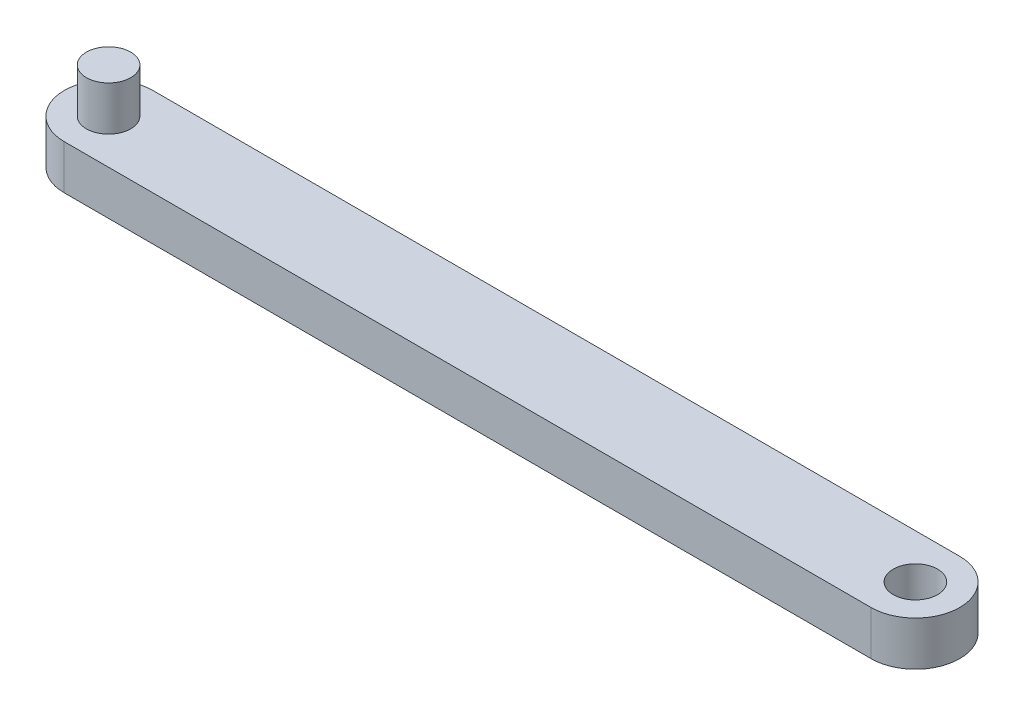
ISO-10303-21;
HEADER;
FILE_DESCRIPTION(('STEP AP214'),'2;1');
FILE_NAME('part.step','',(''),(''),'','','');
FILE_SCHEMA(('AUTOMOTIVE_DESIGN { 1 0 10303 214 1 1 1 1 }'));
ENDSEC;
DATA;
#1=APPLICATION_CONTEXT('core data for automotive mechanical design processes');
#2=APPLICATION_PROTOCOL_DEFINITION('international standard','automotive_design',2000,#1);
#3=PRODUCT_CONTEXT('',#1,'mechanical');
#4=PRODUCT('Part','Part','',(#3));
#5=PRODUCT_RELATED_PRODUCT_CATEGORY('part','',(#4));
#6=PRODUCT_DEFINITION_FORMATION('','',#4);
#7=PRODUCT_DEFINITION_CONTEXT('part definition',#1,'design');
#8=PRODUCT_DEFINITION('design','',#6,#7);
#9=PRODUCT_DEFINITION_SHAPE('','',#8);
#10=(LENGTH_UNIT() NAMED_UNIT(*) SI_UNIT(.MILLI.,.METRE.));
#11=(NAMED_UNIT(*) PLANE_ANGLE_UNIT() SI_UNIT($,.RADIAN.));
#12=(NAMED_UNIT(*) SI_UNIT($,.STERADIAN.) SOLID_ANGLE_UNIT());
#13=UNCERTAINTY_MEASURE_WITH_UNIT(LENGTH_MEASURE(1.E-05),#10,'distance_accuracy_value','');
#14=(GEOMETRIC_REPRESENTATION_CONTEXT(3) GLOBAL_UNCERTAINTY_ASSIGNED_CONTEXT((#13)) GLOBAL_UNIT_ASSIGNED_CONTEXT((#10,
#11,#12)) REPRESENTATION_CONTEXT('',''));
#15=CARTESIAN_POINT('',(0.,0.,0.));
#16=DIRECTION('',(0.,0.,1.));
#17=DIRECTION('',(1.,0.,0.));
#18=AXIS2_PLACEMENT_3D('',#15,#16,#17);
#19=CARTESIAN_POINT('',(91.,5.,0.));
#20=DIRECTION('',(0.,-1.,0.));
#21=DIRECTION('',(0.,0.,-1.));
#22=AXIS2_PLACEMENT_3D('',#19,#20,#21);
#23=PLANE('',#22);
#24=CARTESIAN_POINT('',(91.,5.,0.));
#25=DIRECTION('',(0.,1.,0.));
#26=DIRECTION('',(0.,0.,-1.));
#27=AXIS2_PLACEMENT_3D('',#24,#25,#26);
#28=CIRCLE('',#27,10.);
#29=CARTESIAN_POINT('',(91.,5.,10.));
#30=VERTEX_POINT('',#29);
#31=CARTESIAN_POINT('',(91.,5.,-10.));
#32=VERTEX_POINT('',#31);
#33=EDGE_CURVE('E92',#30,#32,#28,.T.);
#34=ORIENTED_EDGE('',*,*,#33,.T.);
#35=DIRECTION('',(-1.,0.,0.));
#36=VECTOR('',#35,1.);
#37=CARTESIAN_POINT('',(-91.,5.,-9.99999999999999));
#38=LINE('',#37,#36);
#39=CARTESIAN_POINT('',(-91.,5.,-9.99999999999999));
#40=VERTEX_POINT('',#39);
#41=EDGE_CURVE('E87',#32,#40,#38,.T.);
#42=ORIENTED_EDGE('',*,*,#41,.T.);
#43=CARTESIAN_POINT('',(-91.,5.,0.));
#44=DIRECTION('',(0.,1.,0.));
#45=DIRECTION('',(0.,0.,-1.));
#46=AXIS2_PLACEMENT_3D('',#43,#44,#45);
#47=CIRCLE('',#46,10.);
#48=CARTESIAN_POINT('',(-91.,5.,10.));
#49=VERTEX_POINT('',#48);
#50=EDGE_CURVE('E90',#40,#49,#47,.T.);
#51=ORIENTED_EDGE('',*,*,#50,.T.);
#52=DIRECTION('',(1.,0.,0.));
#53=VECTOR('',#52,1.);
#54=CARTESIAN_POINT('',(-91.,5.,10.));
#55=LINE('',#54,#53);
#56=EDGE_CURVE('E57',#49,#30,#55,.T.);
#57=ORIENTED_EDGE('',*,*,#56,.T.);
#58=EDGE_LOOP('',(#34,#42,#51,#57));
#59=FACE_BOUND('',#58,.T.);
#60=CARTESIAN_POINT('',(-91.,5.,0.));
#61=DIRECTION('',(0.,1.,0.));
#62=DIRECTION('',(0.,0.,1.));
#63=AXIS2_PLACEMENT_3D('',#60,#61,#62);
#64=CIRCLE('',#63,5.);
#65=CARTESIAN_POINT('',(-91.,5.,5.00000000000001));
#66=VERTEX_POINT('',#65);
#67=EDGE_CURVE('E112',#66,#66,#64,.T.);
#68=ORIENTED_EDGE('',*,*,#67,.F.);
#69=EDGE_LOOP('',(#68));
#70=FACE_BOUND('',#69,.T.);
#71=CARTESIAN_POINT('',(91.,5.,0.));
#72=DIRECTION('',(0.,1.,0.));
#73=DIRECTION('',(0.,0.,1.));
#74=AXIS2_PLACEMENT_3D('',#71,#72,#73);
#75=CIRCLE('',#74,5.);
#76=CARTESIAN_POINT('',(91.,5.,5.));
#77=VERTEX_POINT('',#76);
#78=EDGE_CURVE('E133',#77,#77,#75,.T.);
#79=ORIENTED_EDGE('',*,*,#78,.F.);
#80=EDGE_LOOP('',(#79));
#81=FACE_BOUND('',#80,.T.);
#82=ADVANCED_FACE('F39',(#59,#70,#81),#23,.F.);
#83=CARTESIAN_POINT('',(91.,-5.,0.));
#84=DIRECTION('',(0.,-1.,0.));
#85=DIRECTION('',(0.,0.,-1.));
#86=AXIS2_PLACEMENT_3D('',#83,#84,#85);
#87=PLANE('',#86);
#88=CARTESIAN_POINT('',(91.,-5.,0.));
#89=DIRECTION('',(0.,1.,0.));
#90=DIRECTION('',(0.,0.,-1.));
#91=AXIS2_PLACEMENT_3D('',#88,#89,#90);
#92=CIRCLE('',#91,10.);
#93=CARTESIAN_POINT('',(91.,-5.,10.));
#94=VERTEX_POINT('',#93);
#95=CARTESIAN_POINT('',(91.,-5.,-10.));
#96=VERTEX_POINT('',#95);
#97=EDGE_CURVE('E108',#94,#96,#92,.T.);
#98=ORIENTED_EDGE('',*,*,#97,.F.);
#99=DIRECTION('',(1.,0.,0.));
#100=VECTOR('',#99,1.);
#101=CARTESIAN_POINT('',(-91.,-5.,10.));
#102=LINE('',#101,#100);
#103=CARTESIAN_POINT('',(-91.,-5.,10.));
#104=VERTEX_POINT('',#103);
#105=EDGE_CURVE('E80',#104,#94,#102,.T.);
#106=ORIENTED_EDGE('',*,*,#105,.F.);
#107=CARTESIAN_POINT('',(-91.,-5.,0.));
#108=DIRECTION('',(0.,1.,0.));
#109=DIRECTION('',(0.,0.,-1.));
#110=AXIS2_PLACEMENT_3D('',#107,#108,#109);
#111=CIRCLE('',#110,10.);
#112=CARTESIAN_POINT('',(-91.,-5.,-9.99999999999999));
#113=VERTEX_POINT('',#112);
#114=EDGE_CURVE('E74',#113,#104,#111,.T.);
#115=ORIENTED_EDGE('',*,*,#114,.F.);
#116=DIRECTION('',(-1.,0.,0.));
#117=VECTOR('',#116,1.);
#118=CARTESIAN_POINT('',(-91.,-5.,-9.99999999999999));
#119=LINE('',#118,#117);
#120=EDGE_CURVE('E97',#96,#113,#119,.T.);
#121=ORIENTED_EDGE('',*,*,#120,.F.);
#122=EDGE_LOOP('',(#98,#106,#115,#121));
#123=FACE_BOUND('',#122,.T.);
#124=CARTESIAN_POINT('',(91.,-5.,0.));
#125=DIRECTION('',(0.,1.,0.));
#126=DIRECTION('',(0.,0.,1.));
#127=AXIS2_PLACEMENT_3D('',#124,#125,#126);
#128=CIRCLE('',#127,5.);
#129=CARTESIAN_POINT('',(91.,-5.,5.));
#130=VERTEX_POINT('',#129);
#131=EDGE_CURVE('E134',#130,#130,#128,.T.);
#132=ORIENTED_EDGE('',*,*,#131,.T.);
#133=EDGE_LOOP('',(#132));
#134=FACE_BOUND('',#133,.T.);
#135=ADVANCED_FACE('F125',(#123,#134),#87,.T.);
#136=CARTESIAN_POINT('',(91.,5.,0.));
#137=DIRECTION('',(0.,-1.,0.));
#138=DIRECTION('',(0.,0.,-1.));
#139=AXIS2_PLACEMENT_3D('',#136,#137,#138);
#140=CYLINDRICAL_SURFACE('',#139,10.);
#141=ORIENTED_EDGE('',*,*,#97,.T.);
#142=DIRECTION('',(0.,-1.,0.));
#143=VECTOR('',#142,1.);
#144=CARTESIAN_POINT('',(91.,5.,-10.));
#145=LINE('',#144,#143);
#146=EDGE_CURVE('E11',#32,#96,#145,.T.);
#147=ORIENTED_EDGE('',*,*,#146,.F.);
#148=ORIENTED_EDGE('',*,*,#33,.F.);
#149=DIRECTION('',(0.,-1.,0.));
#150=VECTOR('',#149,1.);
#151=CARTESIAN_POINT('',(91.,5.,10.));
#152=LINE('',#151,#150);
#153=EDGE_CURVE('E104',#30,#94,#152,.T.);
#154=ORIENTED_EDGE('',*,*,#153,.T.);
#155=EDGE_LOOP('',(#141,#147,#148,#154));
#156=FACE_BOUND('',#155,.T.);
#157=ADVANCED_FACE('F41',(#156),#140,.T.);
#158=CARTESIAN_POINT('',(-91.,5.,-9.99999999999999));
#159=DIRECTION('',(0.,0.,1.));
#160=DIRECTION('',(1.,0.,0.));
#161=AXIS2_PLACEMENT_3D('',#158,#159,#160);
#162=PLANE('',#161);
#163=ORIENTED_EDGE('',*,*,#120,.T.);
#164=DIRECTION('',(0.,-1.,0.));
#165=VECTOR('',#164,1.);
#166=CARTESIAN_POINT('',(-91.,5.,-9.99999999999999));
#167=LINE('',#166,#165);
#168=EDGE_CURVE('E49',#40,#113,#167,.T.);
#169=ORIENTED_EDGE('',*,*,#168,.F.);
#170=ORIENTED_EDGE('',*,*,#41,.F.);
#171=ORIENTED_EDGE('',*,*,#146,.T.);
#172=EDGE_LOOP('',(#163,#169,#170,#171));
#173=FACE_BOUND('',#172,.T.);
#174=ADVANCED_FACE('F96',(#173),#162,.F.);
#175=CARTESIAN_POINT('',(-91.,5.,0.));
#176=DIRECTION('',(0.,-1.,0.));
#177=DIRECTION('',(0.,0.,-1.));
#178=AXIS2_PLACEMENT_3D('',#175,#176,#177);
#179=CYLINDRICAL_SURFACE('',#178,10.);
#180=ORIENTED_EDGE('',*,*,#114,.T.);
#181=DIRECTION('',(0.,-1.,0.));
#182=VECTOR('',#181,1.);
#183=CARTESIAN_POINT('',(-91.,5.,10.));
#184=LINE('',#183,#182);
#185=EDGE_CURVE('E99',#49,#104,#184,.T.);
#186=ORIENTED_EDGE('',*,*,#185,.F.);
#187=ORIENTED_EDGE('',*,*,#50,.F.);
#188=ORIENTED_EDGE('',*,*,#168,.T.);
#189=EDGE_LOOP('',(#180,#186,#187,#188));
#190=FACE_BOUND('',#189,.T.);
#191=ADVANCED_FACE('F100',(#190),#179,.T.);
#192=CARTESIAN_POINT('',(-91.,5.,10.));
#193=DIRECTION('',(0.,0.,-1.));
#194=DIRECTION('',(-1.,0.,0.));
#195=AXIS2_PLACEMENT_3D('',#192,#193,#194);
#196=PLANE('',#195);
#197=ORIENTED_EDGE('',*,*,#105,.T.);
#198=ORIENTED_EDGE('',*,*,#153,.F.);
#199=ORIENTED_EDGE('',*,*,#56,.F.);
#200=ORIENTED_EDGE('',*,*,#185,.T.);
#201=EDGE_LOOP('',(#197,#198,#199,#200));
#202=FACE_BOUND('',#201,.T.);
#203=ADVANCED_FACE('F122',(#202),#196,.F.);
#204=CARTESIAN_POINT('',(91.,5.,0.));
#205=DIRECTION('',(0.,-1.,0.));
#206=DIRECTION('',(0.,0.,-1.));
#207=AXIS2_PLACEMENT_3D('',#204,#205,#206);
#208=CYLINDRICAL_SURFACE('',#207,5.);
#209=ORIENTED_EDGE('',*,*,#78,.T.);
#210=EDGE_LOOP('',(#209));
#211=FACE_BOUND('',#210,.T.);
#212=ORIENTED_EDGE('',*,*,#131,.F.);
#213=EDGE_LOOP('',(#212));
#214=FACE_BOUND('',#213,.T.);
#215=ADVANCED_FACE('F151',(#211,#214),#208,.F.);
#216=CARTESIAN_POINT('',(-91.,-5.,0.));
#217=DIRECTION('',(0.,1.,0.));
#218=DIRECTION('',(0.,0.,1.));
#219=AXIS2_PLACEMENT_3D('',#216,#217,#218);
#220=CYLINDRICAL_SURFACE('',#219,5.);
#221=CARTESIAN_POINT('',(-91.,15.,0.));
#222=DIRECTION('',(0.,1.,0.));
#223=DIRECTION('',(0.,0.,1.));
#224=AXIS2_PLACEMENT_3D('',#221,#222,#223);
#225=CIRCLE('',#224,5.);
#226=CARTESIAN_POINT('',(-91.,15.,5.00000000000001));
#227=VERTEX_POINT('',#226);
#228=EDGE_CURVE('E138',#227,#227,#225,.T.);
#229=ORIENTED_EDGE('',*,*,#228,.F.);
#230=EDGE_LOOP('',(#229));
#231=FACE_BOUND('',#230,.T.);
#232=ORIENTED_EDGE('',*,*,#67,.T.);
#233=EDGE_LOOP('',(#232));
#234=FACE_BOUND('',#233,.T.);
#235=ADVANCED_FACE('F148',(#231,#234),#220,.T.);
#236=CARTESIAN_POINT('',(-91.,15.,0.));
#237=DIRECTION('',(0.,1.,0.));
#238=DIRECTION('',(0.,0.,1.));
#239=AXIS2_PLACEMENT_3D('',#236,#237,#238);
#240=PLANE('',#239);
#241=ORIENTED_EDGE('',*,*,#228,.T.);
#242=EDGE_LOOP('',(#241));
#243=FACE_BOUND('',#242,.T.);
#244=ADVANCED_FACE('F146',(#243),#240,.T.);
#245=CLOSED_SHELL('',(#82,#135,#157,#174,#191,#203,#215,#235,#244));
#246=MANIFOLD_SOLID_BREP('B2',#245);
#247=ADVANCED_BREP_SHAPE_REPRESENTATION('',(#18,#246),#14);
#248=SHAPE_DEFINITION_REPRESENTATION(#9,#247);
ENDSEC;
END-ISO-10303-21;
